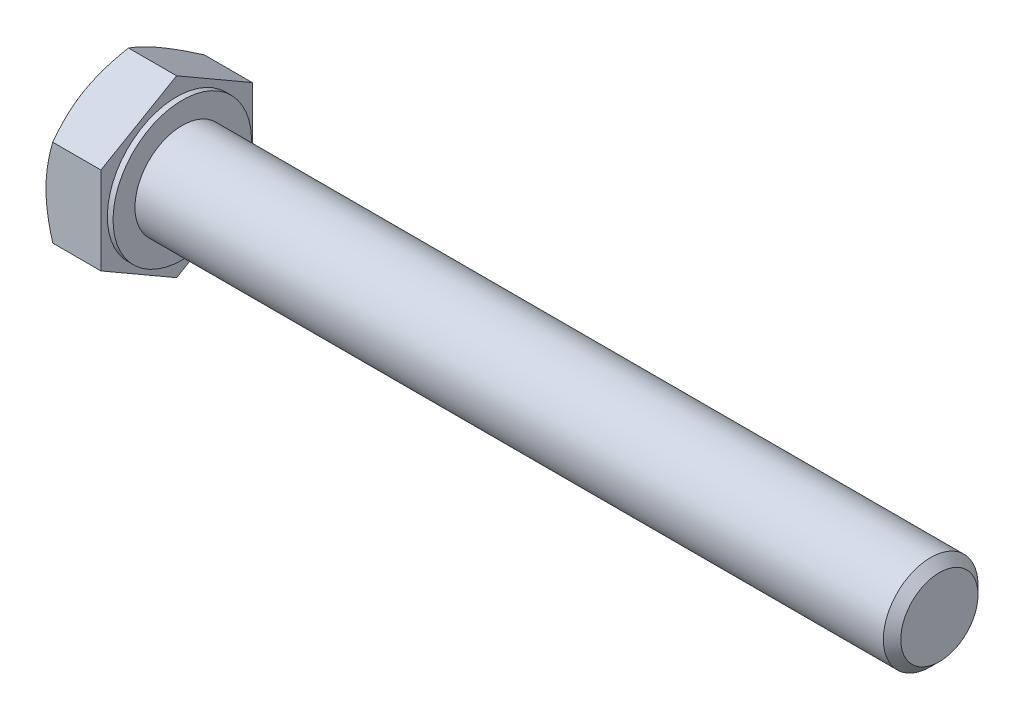
ISO-10303-21;
HEADER;
FILE_DESCRIPTION(('STEP AP214'),'2;1');
FILE_NAME('part.step','',(''),(''),'','','');
FILE_SCHEMA(('AUTOMOTIVE_DESIGN { 1 0 10303 214 1 1 1 1 }'));
ENDSEC;
DATA;
#1=APPLICATION_CONTEXT('core data for automotive mechanical design processes');
#2=APPLICATION_PROTOCOL_DEFINITION('international standard','automotive_design',2000,#1);
#3=PRODUCT_CONTEXT('',#1,'mechanical');
#4=PRODUCT('Part','Part','',(#3));
#5=PRODUCT_RELATED_PRODUCT_CATEGORY('part','',(#4));
#6=PRODUCT_DEFINITION_FORMATION('','',#4);
#7=PRODUCT_DEFINITION_CONTEXT('part definition',#1,'design');
#8=PRODUCT_DEFINITION('design','',#6,#7);
#9=PRODUCT_DEFINITION_SHAPE('','',#8);
#10=(LENGTH_UNIT() NAMED_UNIT(*) SI_UNIT(.MILLI.,.METRE.));
#11=(NAMED_UNIT(*) PLANE_ANGLE_UNIT() SI_UNIT($,.RADIAN.));
#12=(NAMED_UNIT(*) SI_UNIT($,.STERADIAN.) SOLID_ANGLE_UNIT());
#13=UNCERTAINTY_MEASURE_WITH_UNIT(LENGTH_MEASURE(1.E-05),#10,'distance_accuracy_value','');
#14=(GEOMETRIC_REPRESENTATION_CONTEXT(3) GLOBAL_UNCERTAINTY_ASSIGNED_CONTEXT((#13)) GLOBAL_UNIT_ASSIGNED_CONTEXT((#10,
#11,#12)) REPRESENTATION_CONTEXT('',''));
#15=CARTESIAN_POINT('',(0.,0.,0.));
#16=DIRECTION('',(0.,0.,1.));
#17=DIRECTION('',(1.,0.,0.));
#18=AXIS2_PLACEMENT_3D('',#15,#16,#17);
#19=CARTESIAN_POINT('',(0.,6.1575,0.));
#20=DIRECTION('',(1.,0.,0.));
#21=DIRECTION('',(0.,1.,0.));
#22=AXIS2_PLACEMENT_3D('',#19,#20,#21);
#23=PLANE('',#22);
#24=CARTESIAN_POINT('',(0.,0.,0.));
#25=DIRECTION('',(1.,0.,0.));
#26=DIRECTION('',(0.,1.,0.));
#27=AXIS2_PLACEMENT_3D('',#24,#25,#26);
#28=CIRCLE('',#27,5.);
#29=CARTESIAN_POINT('',(0.,-5.,0.));
#30=VERTEX_POINT('',#29);
#31=EDGE_CURVE('E179',#30,#30,#28,.T.);
#32=ORIENTED_EDGE('',*,*,#31,.F.);
#33=EDGE_LOOP('',(#32));
#34=FACE_BOUND('',#33,.T.);
#35=CARTESIAN_POINT('',(0.,0.,0.));
#36=DIRECTION('',(1.,0.,0.));
#37=DIRECTION('',(0.,1.,0.));
#38=AXIS2_PLACEMENT_3D('',#35,#36,#37);
#39=CIRCLE('',#38,7.315);
#40=CARTESIAN_POINT('',(0.,-7.315,0.));
#41=VERTEX_POINT('',#40);
#42=EDGE_CURVE('E30',#41,#41,#39,.T.);
#43=ORIENTED_EDGE('',*,*,#42,.T.);
#44=EDGE_LOOP('',(#43));
#45=FACE_BOUND('',#44,.T.);
#46=ADVANCED_FACE('F17',(#34,#45),#23,.T.);
#47=CARTESIAN_POINT('',(-0.300049999999992,0.,0.));
#48=DIRECTION('',(1.,0.,0.));
#49=DIRECTION('',(0.,1.,0.));
#50=AXIS2_PLACEMENT_3D('',#47,#48,#49);
#51=CYLINDRICAL_SURFACE('',#50,7.315);
#52=ORIENTED_EDGE('',*,*,#42,.F.);
#53=DIRECTION('',(-1.,0.,0.));
#54=VECTOR('',#53,1.);
#55=CARTESIAN_POINT('',(-0.300049999999992,-7.315,0.));
#56=LINE('',#55,#54);
#57=CARTESIAN_POINT('',(-0.6001,-7.315,0.));
#58=VERTEX_POINT('',#57);
#59=EDGE_CURVE('E11',#41,#58,#56,.T.);
#60=ORIENTED_EDGE('',*,*,#59,.T.);
#61=CARTESIAN_POINT('',(-0.6001,0.,0.));
#62=DIRECTION('',(1.,0.,0.));
#63=DIRECTION('',(0.,1.,0.));
#64=AXIS2_PLACEMENT_3D('',#61,#62,#63);
#65=CIRCLE('',#64,7.315);
#66=EDGE_CURVE('E165',#58,#58,#65,.T.);
#67=ORIENTED_EDGE('',*,*,#66,.T.);
#68=ORIENTED_EDGE('',*,*,#59,.F.);
#69=EDGE_LOOP('',(#52,#60,#67,#68));
#70=FACE_BOUND('',#69,.T.);
#71=ADVANCED_FACE('F320',(#70),#51,.T.);
#72=CARTESIAN_POINT('',(-6.4001,0.,0.));
#73=DIRECTION('',(1.,0.,0.));
#74=DIRECTION('',(0.,1.,0.));
#75=AXIS2_PLACEMENT_3D('',#72,#73,#74);
#76=PLANE('',#75);
#77=CARTESIAN_POINT('',(-6.4001,0.,0.));
#78=DIRECTION('',(-1.,0.,0.));
#79=DIRECTION('',(0.,1.,0.));
#80=AXIS2_PLACEMENT_3D('',#77,#78,#79);
#81=CIRCLE('',#80,8.);
#82=CARTESIAN_POINT('',(-6.4001,0.,8.));
#83=VERTEX_POINT('',#82);
#84=CARTESIAN_POINT('',(-6.4001,6.9282032302755,4.));
#85=VERTEX_POINT('',#84);
#86=EDGE_CURVE('E232',#83,#85,#81,.T.);
#87=ORIENTED_EDGE('',*,*,#86,.T.);
#88=CARTESIAN_POINT('',(-6.4001,0.,0.));
#89=DIRECTION('',(-1.,0.,0.));
#90=DIRECTION('',(0.,1.,0.));
#91=AXIS2_PLACEMENT_3D('',#88,#89,#90);
#92=CIRCLE('',#91,8.);
#93=CARTESIAN_POINT('',(-6.4001,6.9282032302755,-4.));
#94=VERTEX_POINT('',#93);
#95=EDGE_CURVE('E271',#85,#94,#92,.T.);
#96=ORIENTED_EDGE('',*,*,#95,.T.);
#97=CARTESIAN_POINT('',(-6.4001,0.,0.));
#98=DIRECTION('',(-1.,0.,0.));
#99=DIRECTION('',(0.,1.,0.));
#100=AXIS2_PLACEMENT_3D('',#97,#98,#99);
#101=CIRCLE('',#100,8.);
#102=CARTESIAN_POINT('',(-6.4001,0.,-8.));
#103=VERTEX_POINT('',#102);
#104=EDGE_CURVE('E159',#94,#103,#101,.T.);
#105=ORIENTED_EDGE('',*,*,#104,.T.);
#106=CARTESIAN_POINT('',(-6.4001,0.,0.));
#107=DIRECTION('',(-1.,0.,0.));
#108=DIRECTION('',(0.,1.,0.));
#109=AXIS2_PLACEMENT_3D('',#106,#107,#108);
#110=CIRCLE('',#109,8.);
#111=CARTESIAN_POINT('',(-6.4001,-6.9282032302755,-4.));
#112=VERTEX_POINT('',#111);
#113=EDGE_CURVE('E148',#103,#112,#110,.T.);
#114=ORIENTED_EDGE('',*,*,#113,.T.);
#115=CARTESIAN_POINT('',(-6.4001,0.,0.));
#116=DIRECTION('',(-1.,0.,0.));
#117=DIRECTION('',(0.,1.,0.));
#118=AXIS2_PLACEMENT_3D('',#115,#116,#117);
#119=CIRCLE('',#118,8.);
#120=CARTESIAN_POINT('',(-6.4001,-6.92820323027551,4.));
#121=VERTEX_POINT('',#120);
#122=EDGE_CURVE('E342',#112,#121,#119,.T.);
#123=ORIENTED_EDGE('',*,*,#122,.T.);
#124=CARTESIAN_POINT('',(-6.4001,0.,0.));
#125=DIRECTION('',(-1.,0.,0.));
#126=DIRECTION('',(0.,1.,0.));
#127=AXIS2_PLACEMENT_3D('',#124,#125,#126);
#128=CIRCLE('',#127,8.);
#129=EDGE_CURVE('E181',#121,#83,#128,.T.);
#130=ORIENTED_EDGE('',*,*,#129,.T.);
#131=EDGE_LOOP('',(#87,#96,#105,#114,#123,#130));
#132=FACE_BOUND('',#131,.T.);
#133=ADVANCED_FACE('F337',(#132),#76,.F.);
#134=CARTESIAN_POINT('',(-0.600099999999993,-9.237604307034,0.));
#135=DIRECTION('',(0.,-0.866025403784439,-0.5));
#136=DIRECTION('',(0.,0.5,-0.866025403784439));
#137=AXIS2_PLACEMENT_3D('',#134,#135,#136);
#138=PLANE('',#137);
#139=CARTESIAN_POINT('',(-6.4001,-6.9282032302755,-4.));
#140=CARTESIAN_POINT('',(-6.40010000000002,-5.85640646055103,-5.856406460551));
#141=CARTESIAN_POINT('',(-5.6855688201837,-4.61880215351702,-8.));
#142=(BOUNDED_CURVE() B_SPLINE_CURVE(2,(#139,#140,#141),.UNSPECIFIED.,.F.,
.F.) B_SPLINE_CURVE_WITH_KNOTS((3,3),(0.46856777502019,0.937135550040381),
.UNSPECIFIED.) CURVE() GEOMETRIC_REPRESENTATION_ITEM() RATIONAL_B_SPLINE_CURVE((1.,
1.03795484930206,1.)) REPRESENTATION_ITEM(''));
#143=CARTESIAN_POINT('',(-5.6855688201837,-4.61880215351701,-8.));
#144=VERTEX_POINT('',#143);
#145=EDGE_CURVE('E142',#112,#144,#142,.T.);
#146=ORIENTED_EDGE('',*,*,#145,.T.);
#147=DIRECTION('',(-1.,0.,0.));
#148=VECTOR('',#147,1.);
#149=CARTESIAN_POINT('',(-0.600099999999993,-4.618802153517,-8.));
#150=LINE('',#149,#148);
#151=CARTESIAN_POINT('',(-0.600099999999993,-4.618802153517,-8.));
#152=VERTEX_POINT('',#151);
#153=EDGE_CURVE('E126',#152,#144,#150,.T.);
#154=ORIENTED_EDGE('',*,*,#153,.F.);
#155=DIRECTION('',(0.,0.5,-0.866025403784439));
#156=VECTOR('',#155,1.);
#157=CARTESIAN_POINT('',(-0.600099999999993,-9.237604307034,0.));
#158=LINE('',#157,#156);
#159=CARTESIAN_POINT('',(-0.600099999999993,-9.237604307034,0.));
#160=VERTEX_POINT('',#159);
#161=EDGE_CURVE('E266',#160,#152,#158,.T.);
#162=ORIENTED_EDGE('',*,*,#161,.F.);
#163=DIRECTION('',(-1.,0.,0.));
#164=VECTOR('',#163,1.);
#165=CARTESIAN_POINT('',(-0.600099999999993,-9.237604307034,0.));
#166=LINE('',#165,#164);
#167=CARTESIAN_POINT('',(-5.6855688201837,-9.23760430703399,0.));
#168=VERTEX_POINT('',#167);
#169=EDGE_CURVE('E237',#160,#168,#166,.T.);
#170=ORIENTED_EDGE('',*,*,#169,.T.);
#171=CARTESIAN_POINT('',(-5.6855688201837,-9.23760430703399,0.));
#172=CARTESIAN_POINT('',(-6.40010000000002,-7.99999999999998,-2.14359353944901));
#173=CARTESIAN_POINT('',(-6.4001,-6.9282032302755,-4.));
#174=(BOUNDED_CURVE() B_SPLINE_CURVE(2,(#171,#172,#173),.UNSPECIFIED.,.F.,
.F.) B_SPLINE_CURVE_WITH_KNOTS((3,3),(0.,0.46856777502019),
.UNSPECIFIED.) CURVE() GEOMETRIC_REPRESENTATION_ITEM() RATIONAL_B_SPLINE_CURVE((1.,
1.03795484930205,1.)) REPRESENTATION_ITEM(''));
#175=EDGE_CURVE('E21',#168,#112,#174,.T.);
#176=ORIENTED_EDGE('',*,*,#175,.T.);
#177=EDGE_LOOP('',(#146,#154,#162,#170,#176));
#178=FACE_BOUND('',#177,.T.);
#179=ADVANCED_FACE('F143',(#178),#138,.T.);
#180=CARTESIAN_POINT('',(-0.600099999999993,-4.61880215351701,8.));
#181=DIRECTION('',(0.,-0.866025403784439,0.5));
#182=DIRECTION('',(-1.,0.,0.));
#183=AXIS2_PLACEMENT_3D('',#180,#181,#182);
#184=PLANE('',#183);
#185=CARTESIAN_POINT('',(-6.4001,-6.92820323027551,4.));
#186=CARTESIAN_POINT('',(-6.40010000000001,-7.99999999999999,2.14359353944898));
#187=CARTESIAN_POINT('',(-5.6855688201837,-9.23760430703399,0.));
#188=(BOUNDED_CURVE() B_SPLINE_CURVE(2,(#185,#186,#187),.UNSPECIFIED.,.F.,
.F.) B_SPLINE_CURVE_WITH_KNOTS((3,3),(0.468567775020191,0.937135550040381),
.UNSPECIFIED.) CURVE() GEOMETRIC_REPRESENTATION_ITEM() RATIONAL_B_SPLINE_CURVE((1.,
1.03795484930204,1.)) REPRESENTATION_ITEM(''));
#189=EDGE_CURVE('E354',#121,#168,#188,.T.);
#190=ORIENTED_EDGE('',*,*,#189,.T.);
#191=ORIENTED_EDGE('',*,*,#169,.F.);
#192=DIRECTION('',(0.,-0.5,-0.866025403784439));
#193=VECTOR('',#192,1.);
#194=CARTESIAN_POINT('',(-0.600099999999993,-4.61880215351701,8.));
#195=LINE('',#194,#193);
#196=CARTESIAN_POINT('',(-0.600099999999993,-4.61880215351701,8.));
#197=VERTEX_POINT('',#196);
#198=EDGE_CURVE('E173',#197,#160,#195,.T.);
#199=ORIENTED_EDGE('',*,*,#198,.F.);
#200=DIRECTION('',(-1.,0.,0.));
#201=VECTOR('',#200,1.);
#202=CARTESIAN_POINT('',(-0.600099999999993,-4.61880215351701,8.));
#203=LINE('',#202,#201);
#204=CARTESIAN_POINT('',(-5.6855688201837,-4.61880215351698,8.));
#205=VERTEX_POINT('',#204);
#206=EDGE_CURVE('E242',#197,#205,#203,.T.);
#207=ORIENTED_EDGE('',*,*,#206,.T.);
#208=CARTESIAN_POINT('',(-5.6855688201837,-4.61880215351703,8.));
#209=CARTESIAN_POINT('',(-6.40010000000001,-5.85640646055102,5.85640646055101));
#210=CARTESIAN_POINT('',(-6.4001,-6.92820323027551,4.));
#211=(BOUNDED_CURVE() B_SPLINE_CURVE(2,(#208,#209,#210),.UNSPECIFIED.,.F.,
.F.) B_SPLINE_CURVE_WITH_KNOTS((3,3),(0.,0.468567775020191),
.UNSPECIFIED.) CURVE() GEOMETRIC_REPRESENTATION_ITEM() RATIONAL_B_SPLINE_CURVE((1.,
1.03795484930204,1.)) REPRESENTATION_ITEM(''));
#212=EDGE_CURVE('E195',#205,#121,#211,.T.);
#213=ORIENTED_EDGE('',*,*,#212,.T.);
#214=EDGE_LOOP('',(#190,#191,#199,#207,#213));
#215=FACE_BOUND('',#214,.T.);
#216=ADVANCED_FACE('F578',(#215),#184,.T.);
#217=CARTESIAN_POINT('',(-0.6001,4.618802153517,8.));
#218=DIRECTION('',(0.,0.,1.));
#219=DIRECTION('',(0.,-1.,0.));
#220=AXIS2_PLACEMENT_3D('',#217,#218,#219);
#221=PLANE('',#220);
#222=CARTESIAN_POINT('',(-6.4001,0.,8.));
#223=CARTESIAN_POINT('',(-6.40010000000001,-2.14359353944897,7.99999999999999));
#224=CARTESIAN_POINT('',(-5.6855688201837,-4.61880215351698,8.));
#225=(BOUNDED_CURVE() B_SPLINE_CURVE(2,(#222,#223,#224),.UNSPECIFIED.,.F.,
.F.) B_SPLINE_CURVE_WITH_KNOTS((3,3),(0.468567775020191,0.937135550040382),
.UNSPECIFIED.) CURVE() GEOMETRIC_REPRESENTATION_ITEM() RATIONAL_B_SPLINE_CURVE((1.,
1.03795484930205,1.)) REPRESENTATION_ITEM(''));
#226=EDGE_CURVE('E185',#83,#205,#225,.T.);
#227=ORIENTED_EDGE('',*,*,#226,.T.);
#228=ORIENTED_EDGE('',*,*,#206,.F.);
#229=DIRECTION('',(0.,-1.,0.));
#230=VECTOR('',#229,1.);
#231=CARTESIAN_POINT('',(-0.6001,4.618802153517,8.));
#232=LINE('',#231,#230);
#233=CARTESIAN_POINT('',(-0.6001,4.618802153517,8.));
#234=VERTEX_POINT('',#233);
#235=EDGE_CURVE('E166',#234,#197,#232,.T.);
#236=ORIENTED_EDGE('',*,*,#235,.F.);
#237=DIRECTION('',(-1.,0.,0.));
#238=VECTOR('',#237,1.);
#239=CARTESIAN_POINT('',(-0.6001,4.618802153517,8.));
#240=LINE('',#239,#238);
#241=CARTESIAN_POINT('',(-5.6855688201837,4.61880215351697,8.));
#242=VERTEX_POINT('',#241);
#243=EDGE_CURVE('E213',#234,#242,#240,.T.);
#244=ORIENTED_EDGE('',*,*,#243,.T.);
#245=CARTESIAN_POINT('',(-5.6855688201837,4.61880215351696,8.));
#246=CARTESIAN_POINT('',(-6.40010000000001,2.14359353944896,8.));
#247=CARTESIAN_POINT('',(-6.4001,0.,8.));
#248=(BOUNDED_CURVE() B_SPLINE_CURVE(2,(#245,#246,#247),.UNSPECIFIED.,.F.,
.F.) B_SPLINE_CURVE_WITH_KNOTS((3,3),(0.,0.468567775020191),
.UNSPECIFIED.) CURVE() GEOMETRIC_REPRESENTATION_ITEM() RATIONAL_B_SPLINE_CURVE((1.,
1.03795484930204,1.)) REPRESENTATION_ITEM(''));
#249=EDGE_CURVE('E201',#242,#83,#248,.T.);
#250=ORIENTED_EDGE('',*,*,#249,.T.);
#251=EDGE_LOOP('',(#227,#228,#236,#244,#250));
#252=FACE_BOUND('',#251,.T.);
#253=ADVANCED_FACE('F325',(#252),#221,.T.);
#254=CARTESIAN_POINT('',(-0.6001,0.,0.));
#255=DIRECTION('',(1.,0.,0.));
#256=DIRECTION('',(0.,1.,0.));
#257=AXIS2_PLACEMENT_3D('',#254,#255,#256);
#258=PLANE('',#257);
#259=ORIENTED_EDGE('',*,*,#66,.F.);
#260=EDGE_LOOP('',(#259));
#261=FACE_BOUND('',#260,.T.);
#262=DIRECTION('',(0.,-0.5,0.866025403784438));
#263=VECTOR('',#262,1.);
#264=CARTESIAN_POINT('',(-0.6001,9.237604307034,0.));
#265=LINE('',#264,#263);
#266=CARTESIAN_POINT('',(-0.6001,9.237604307034,0.));
#267=VERTEX_POINT('',#266);
#268=EDGE_CURVE('E174',#267,#234,#265,.T.);
#269=ORIENTED_EDGE('',*,*,#268,.T.);
#270=ORIENTED_EDGE('',*,*,#235,.T.);
#271=ORIENTED_EDGE('',*,*,#198,.T.);
#272=ORIENTED_EDGE('',*,*,#161,.T.);
#273=DIRECTION('',(0.,1.,0.));
#274=VECTOR('',#273,1.);
#275=CARTESIAN_POINT('',(-0.600099999999993,-4.618802153517,-8.));
#276=LINE('',#275,#274);
#277=CARTESIAN_POINT('',(-0.6001,4.618802153517,-8.));
#278=VERTEX_POINT('',#277);
#279=EDGE_CURVE('E134',#152,#278,#276,.T.);
#280=ORIENTED_EDGE('',*,*,#279,.T.);
#281=DIRECTION('',(0.,0.5,0.866025403784439));
#282=VECTOR('',#281,1.);
#283=CARTESIAN_POINT('',(-0.6001,4.618802153517,-8.));
#284=LINE('',#283,#282);
#285=EDGE_CURVE('E216',#278,#267,#284,.T.);
#286=ORIENTED_EDGE('',*,*,#285,.T.);
#287=EDGE_LOOP('',(#269,#270,#271,#272,#280,#286));
#288=FACE_BOUND('',#287,.T.);
#289=ADVANCED_FACE('F322',(#261,#288),#258,.T.);
#290=CARTESIAN_POINT('',(-0.6001,9.237604307034,0.));
#291=DIRECTION('',(0.,0.866025403784438,0.5));
#292=DIRECTION('',(1.,0.,0.));
#293=AXIS2_PLACEMENT_3D('',#290,#291,#292);
#294=PLANE('',#293);
#295=CARTESIAN_POINT('',(-5.6855688201837,9.23760430703399,0.));
#296=CARTESIAN_POINT('',(-6.40010000000001,7.99999999999999,2.143593539449));
#297=CARTESIAN_POINT('',(-6.4001,6.9282032302755,4.));
#298=(BOUNDED_CURVE() B_SPLINE_CURVE(2,(#295,#296,#297),.UNSPECIFIED.,.F.,
.F.) B_SPLINE_CURVE_WITH_KNOTS((3,3),(0.,0.46856777502019),
.UNSPECIFIED.) CURVE() GEOMETRIC_REPRESENTATION_ITEM() RATIONAL_B_SPLINE_CURVE((1.,
1.03795484930204,1.)) REPRESENTATION_ITEM(''));
#299=CARTESIAN_POINT('',(-5.6855688201837,9.23760430703399,0.));
#300=VERTEX_POINT('',#299);
#301=EDGE_CURVE('E275',#300,#85,#298,.T.);
#302=ORIENTED_EDGE('',*,*,#301,.T.);
#303=CARTESIAN_POINT('',(-6.4001,6.9282032302755,4.));
#304=CARTESIAN_POINT('',(-6.40010000000001,5.85640646055102,5.856406460551));
#305=CARTESIAN_POINT('',(-5.6855688201837,4.61880215351702,8.));
#306=(BOUNDED_CURVE() B_SPLINE_CURVE(2,(#303,#304,#305),.UNSPECIFIED.,.F.,
.F.) B_SPLINE_CURVE_WITH_KNOTS((3,3),(0.46856777502019,0.937135550040381),
.UNSPECIFIED.) CURVE() GEOMETRIC_REPRESENTATION_ITEM() RATIONAL_B_SPLINE_CURVE((1.,
1.03795484930203,1.)) REPRESENTATION_ITEM(''));
#307=EDGE_CURVE('E212',#85,#242,#306,.T.);
#308=ORIENTED_EDGE('',*,*,#307,.T.);
#309=ORIENTED_EDGE('',*,*,#243,.F.);
#310=ORIENTED_EDGE('',*,*,#268,.F.);
#311=DIRECTION('',(-1.,0.,0.));
#312=VECTOR('',#311,1.);
#313=CARTESIAN_POINT('',(-0.6001,9.237604307034,0.));
#314=LINE('',#313,#312);
#315=EDGE_CURVE('E138',#267,#300,#314,.T.);
#316=ORIENTED_EDGE('',*,*,#315,.T.);
#317=EDGE_LOOP('',(#302,#308,#309,#310,#316));
#318=FACE_BOUND('',#317,.T.);
#319=ADVANCED_FACE('F324',(#318),#294,.T.);
#320=CARTESIAN_POINT('',(-0.6001,4.618802153517,-8.));
#321=DIRECTION('',(0.,0.866025403784439,-0.5));
#322=DIRECTION('',(-1.,0.,0.));
#323=AXIS2_PLACEMENT_3D('',#320,#321,#322);
#324=PLANE('',#323);
#325=CARTESIAN_POINT('',(-5.6855688201837,4.61880215351702,-8.));
#326=CARTESIAN_POINT('',(-6.40010000000002,5.85640646055102,-5.856406460551));
#327=CARTESIAN_POINT('',(-6.4001,6.9282032302755,-4.));
#328=(BOUNDED_CURVE() B_SPLINE_CURVE(2,(#325,#326,#327),.UNSPECIFIED.,.F.,
.F.) B_SPLINE_CURVE_WITH_KNOTS((3,3),(0.,0.468567775020191),
.UNSPECIFIED.) CURVE() GEOMETRIC_REPRESENTATION_ITEM() RATIONAL_B_SPLINE_CURVE((1.,
1.03795484930204,1.)) REPRESENTATION_ITEM(''));
#329=CARTESIAN_POINT('',(-5.6855688201837,4.61880215351698,-8.));
#330=VERTEX_POINT('',#329);
#331=EDGE_CURVE('E153',#330,#94,#328,.T.);
#332=ORIENTED_EDGE('',*,*,#331,.T.);
#333=CARTESIAN_POINT('',(-6.4001,6.9282032302755,-4.));
#334=CARTESIAN_POINT('',(-6.40010000000002,7.99999999999999,-2.14359353944899));
#335=CARTESIAN_POINT('',(-5.6855688201837,9.23760430703399,0.));
#336=(BOUNDED_CURVE() B_SPLINE_CURVE(2,(#333,#334,#335),.UNSPECIFIED.,.F.,
.F.) B_SPLINE_CURVE_WITH_KNOTS((3,3),(0.468567775020191,0.937135550040382),
.UNSPECIFIED.) CURVE() GEOMETRIC_REPRESENTATION_ITEM() RATIONAL_B_SPLINE_CURVE((1.,
1.03795484930204,1.)) REPRESENTATION_ITEM(''));
#337=EDGE_CURVE('E184',#94,#300,#336,.T.);
#338=ORIENTED_EDGE('',*,*,#337,.T.);
#339=ORIENTED_EDGE('',*,*,#315,.F.);
#340=ORIENTED_EDGE('',*,*,#285,.F.);
#341=DIRECTION('',(-1.,0.,0.));
#342=VECTOR('',#341,1.);
#343=CARTESIAN_POINT('',(-0.6001,4.618802153517,-8.));
#344=LINE('',#343,#342);
#345=EDGE_CURVE('E188',#278,#330,#344,.T.);
#346=ORIENTED_EDGE('',*,*,#345,.T.);
#347=EDGE_LOOP('',(#332,#338,#339,#340,#346));
#348=FACE_BOUND('',#347,.T.);
#349=ADVANCED_FACE('F559',(#348),#324,.T.);
#350=CARTESIAN_POINT('',(-0.600099999999993,-4.618802153517,-8.));
#351=DIRECTION('',(0.,0.,-1.));
#352=DIRECTION('',(-1.,0.,0.));
#353=AXIS2_PLACEMENT_3D('',#350,#351,#352);
#354=PLANE('',#353);
#355=CARTESIAN_POINT('',(-5.6855688201837,-4.61880215351697,-8.));
#356=CARTESIAN_POINT('',(-6.40010000000001,-2.14359353944896,-8.));
#357=CARTESIAN_POINT('',(-6.4001,0.,-8.));
#358=(BOUNDED_CURVE() B_SPLINE_CURVE(2,(#355,#356,#357),.UNSPECIFIED.,.F.,
.F.) B_SPLINE_CURVE_WITH_KNOTS((3,3),(0.,0.468567775020191),
.UNSPECIFIED.) CURVE() GEOMETRIC_REPRESENTATION_ITEM() RATIONAL_B_SPLINE_CURVE((1.,
1.03795484930203,1.)) REPRESENTATION_ITEM(''));
#359=EDGE_CURVE('E130',#144,#103,#358,.T.);
#360=ORIENTED_EDGE('',*,*,#359,.T.);
#361=CARTESIAN_POINT('',(-6.4001,0.,-8.));
#362=CARTESIAN_POINT('',(-6.40010000000001,2.14359353944897,-7.99999999999999));
#363=CARTESIAN_POINT('',(-5.6855688201837,4.61880215351697,-8.));
#364=(BOUNDED_CURVE() B_SPLINE_CURVE(2,(#361,#362,#363),.UNSPECIFIED.,.F.,
.F.) B_SPLINE_CURVE_WITH_KNOTS((3,3),(0.468567775020191,0.937135550040381),
.UNSPECIFIED.) CURVE() GEOMETRIC_REPRESENTATION_ITEM() RATIONAL_B_SPLINE_CURVE((1.,
1.03795484930203,1.)) REPRESENTATION_ITEM(''));
#365=EDGE_CURVE('E219',#103,#330,#364,.T.);
#366=ORIENTED_EDGE('',*,*,#365,.T.);
#367=ORIENTED_EDGE('',*,*,#345,.F.);
#368=ORIENTED_EDGE('',*,*,#279,.F.);
#369=ORIENTED_EDGE('',*,*,#153,.T.);
#370=EDGE_LOOP('',(#360,#366,#367,#368,#369));
#371=FACE_BOUND('',#370,.T.);
#372=ADVANCED_FACE('F19',(#371),#354,.T.);
#373=CARTESIAN_POINT('',(-6.04283441009185,0.,0.));
#374=DIRECTION('',(1.,0.,0.));
#375=DIRECTION('',(0.,1.,0.));
#376=AXIS2_PLACEMENT_3D('',#373,#374,#375);
#377=CONICAL_SURFACE('',#376,8.618802153517,1.0471975511966);
#378=ORIENTED_EDGE('',*,*,#359,.F.);
#379=ORIENTED_EDGE('',*,*,#145,.F.);
#380=ORIENTED_EDGE('',*,*,#113,.F.);
#381=EDGE_LOOP('',(#378,#379,#380));
#382=FACE_BOUND('',#381,.T.);
#383=ADVANCED_FACE('F150',(#382),#377,.T.);
#384=CARTESIAN_POINT('',(-6.04283441009185,0.,0.));
#385=DIRECTION('',(1.,0.,0.));
#386=DIRECTION('',(0.,1.,0.));
#387=AXIS2_PLACEMENT_3D('',#384,#385,#386);
#388=CONICAL_SURFACE('',#387,8.618802153517,1.0471975511966);
#389=ORIENTED_EDGE('',*,*,#365,.F.);
#390=ORIENTED_EDGE('',*,*,#104,.F.);
#391=ORIENTED_EDGE('',*,*,#331,.F.);
#392=EDGE_LOOP('',(#389,#390,#391));
#393=FACE_BOUND('',#392,.T.);
#394=ADVANCED_FACE('F543',(#393),#388,.T.);
#395=CARTESIAN_POINT('',(-6.04283441009185,0.,0.));
#396=DIRECTION('',(1.,0.,0.));
#397=DIRECTION('',(0.,-1.,0.));
#398=AXIS2_PLACEMENT_3D('',#395,#396,#397);
#399=CONICAL_SURFACE('',#398,8.618802153517,1.0471975511966);
#400=ORIENTED_EDGE('',*,*,#175,.F.);
#401=ORIENTED_EDGE('',*,*,#189,.F.);
#402=ORIENTED_EDGE('',*,*,#122,.F.);
#403=EDGE_LOOP('',(#400,#401,#402));
#404=FACE_BOUND('',#403,.T.);
#405=ADVANCED_FACE('F545',(#404),#399,.T.);
#406=CARTESIAN_POINT('',(-6.04283441009185,0.,0.));
#407=DIRECTION('',(1.,0.,0.));
#408=DIRECTION('',(0.,1.,0.));
#409=AXIS2_PLACEMENT_3D('',#406,#407,#408);
#410=CONICAL_SURFACE('',#409,8.618802153517,1.0471975511966);
#411=ORIENTED_EDGE('',*,*,#337,.F.);
#412=ORIENTED_EDGE('',*,*,#95,.F.);
#413=ORIENTED_EDGE('',*,*,#301,.F.);
#414=EDGE_LOOP('',(#411,#412,#413));
#415=FACE_BOUND('',#414,.T.);
#416=ADVANCED_FACE('F552',(#415),#410,.T.);
#417=CARTESIAN_POINT('',(-6.04283441009185,0.,0.));
#418=DIRECTION('',(1.,0.,0.));
#419=DIRECTION('',(0.,1.,0.));
#420=AXIS2_PLACEMENT_3D('',#417,#418,#419);
#421=CONICAL_SURFACE('',#420,8.618802153517,1.0471975511966);
#422=ORIENTED_EDGE('',*,*,#212,.F.);
#423=ORIENTED_EDGE('',*,*,#226,.F.);
#424=ORIENTED_EDGE('',*,*,#129,.F.);
#425=EDGE_LOOP('',(#422,#423,#424));
#426=FACE_BOUND('',#425,.T.);
#427=ADVANCED_FACE('F346',(#426),#421,.T.);
#428=CARTESIAN_POINT('',(-6.04283441009185,0.,0.));
#429=DIRECTION('',(1.,0.,0.));
#430=DIRECTION('',(0.,1.,0.));
#431=AXIS2_PLACEMENT_3D('',#428,#429,#430);
#432=CONICAL_SURFACE('',#431,8.618802153517,1.0471975511966);
#433=ORIENTED_EDGE('',*,*,#307,.F.);
#434=ORIENTED_EDGE('',*,*,#86,.F.);
#435=ORIENTED_EDGE('',*,*,#249,.F.);
#436=EDGE_LOOP('',(#433,#434,#435));
#437=FACE_BOUND('',#436,.T.);
#438=ADVANCED_FACE('F335',(#437),#432,.T.);
#439=CARTESIAN_POINT('',(80.,2.5,0.));
#440=DIRECTION('',(1.,0.,0.));
#441=DIRECTION('',(0.,1.,0.));
#442=AXIS2_PLACEMENT_3D('',#439,#440,#441);
#443=PLANE('',#442);
#444=CARTESIAN_POINT('',(80.,0.,0.));
#445=DIRECTION('',(-1.,0.,0.));
#446=DIRECTION('',(0.,-1.,0.));
#447=AXIS2_PLACEMENT_3D('',#444,#445,#446);
#448=CIRCLE('',#447,4.079825);
#449=CARTESIAN_POINT('',(80.,4.079825,0.));
#450=VERTEX_POINT('',#449);
#451=EDGE_CURVE('E194',#450,#450,#448,.T.);
#452=ORIENTED_EDGE('',*,*,#451,.F.);
#453=EDGE_LOOP('',(#452));
#454=FACE_BOUND('',#453,.T.);
#455=ADVANCED_FACE('F540',(#454),#443,.T.);
#456=CARTESIAN_POINT('',(42.25,0.,0.));
#457=DIRECTION('',(1.,0.,0.));
#458=DIRECTION('',(0.,1.,0.));
#459=AXIS2_PLACEMENT_3D('',#456,#457,#458);
#460=CYLINDRICAL_SURFACE('',#459,5.);
#461=CARTESIAN_POINT('',(79.079725,0.,0.));
#462=DIRECTION('',(1.,0.,0.));
#463=DIRECTION('',(0.,-1.,0.));
#464=AXIS2_PLACEMENT_3D('',#461,#462,#463);
#465=CIRCLE('',#464,5.);
#466=CARTESIAN_POINT('',(79.079725,5.,0.));
#467=VERTEX_POINT('',#466);
#468=CARTESIAN_POINT('',(79.079725,-5.,0.));
#469=VERTEX_POINT('',#468);
#470=EDGE_CURVE('E193',#467,#469,#465,.T.);
#471=ORIENTED_EDGE('',*,*,#470,.F.);
#472=CARTESIAN_POINT('',(79.079725,0.,0.));
#473=DIRECTION('',(1.,0.,0.));
#474=DIRECTION('',(0.,-1.,0.));
#475=AXIS2_PLACEMENT_3D('',#472,#473,#474);
#476=CIRCLE('',#475,5.);
#477=EDGE_CURVE('E180',#469,#467,#476,.T.);
#478=ORIENTED_EDGE('',*,*,#477,.F.);
#479=DIRECTION('',(-1.,0.,0.));
#480=VECTOR('',#479,1.);
#481=CARTESIAN_POINT('',(42.25,-5.,0.));
#482=LINE('',#481,#480);
#483=EDGE_CURVE('E175',#469,#30,#482,.T.);
#484=ORIENTED_EDGE('',*,*,#483,.T.);
#485=ORIENTED_EDGE('',*,*,#31,.T.);
#486=ORIENTED_EDGE('',*,*,#483,.F.);
#487=EDGE_LOOP('',(#471,#478,#484,#485,#486));
#488=FACE_BOUND('',#487,.T.);
#489=ADVANCED_FACE('F480',(#488),#460,.T.);
#490=CARTESIAN_POINT('',(79.5398625,0.,0.));
#491=DIRECTION('',(-1.,0.,0.));
#492=DIRECTION('',(0.,-1.,0.));
#493=AXIS2_PLACEMENT_3D('',#490,#491,#492);
#494=CONICAL_SURFACE('',#493,4.53991250000001,0.785343828859748);
#495=ORIENTED_EDGE('',*,*,#451,.T.);
#496=DIRECTION('',(-0.707145200462814,0.707068359822731,0.));
#497=VECTOR('',#496,1.);
#498=CARTESIAN_POINT('',(79.5398625,4.53991250000001,0.));
#499=LINE('',#498,#497);
#500=EDGE_CURVE('E189',#450,#467,#499,.T.);
#501=ORIENTED_EDGE('',*,*,#500,.T.);
#502=ORIENTED_EDGE('',*,*,#470,.T.);
#503=ORIENTED_EDGE('',*,*,#477,.T.);
#504=ORIENTED_EDGE('',*,*,#500,.F.);
#505=EDGE_LOOP('',(#495,#501,#502,#503,#504));
#506=FACE_BOUND('',#505,.T.);
#507=ADVANCED_FACE('F475',(#506),#494,.T.);
#508=CLOSED_SHELL('',(#46,#71,#133,#179,#216,#253,#289,#319,#349,#372,#383,#394,#405,#416,#427,
#438,#455,#489,#507));
#509=MANIFOLD_SOLID_BREP('B1',#508);
#510=ADVANCED_BREP_SHAPE_REPRESENTATION('',(#18,#509),#14);
#511=SHAPE_DEFINITION_REPRESENTATION(#9,#510);
ENDSEC;
END-ISO-10303-21;
